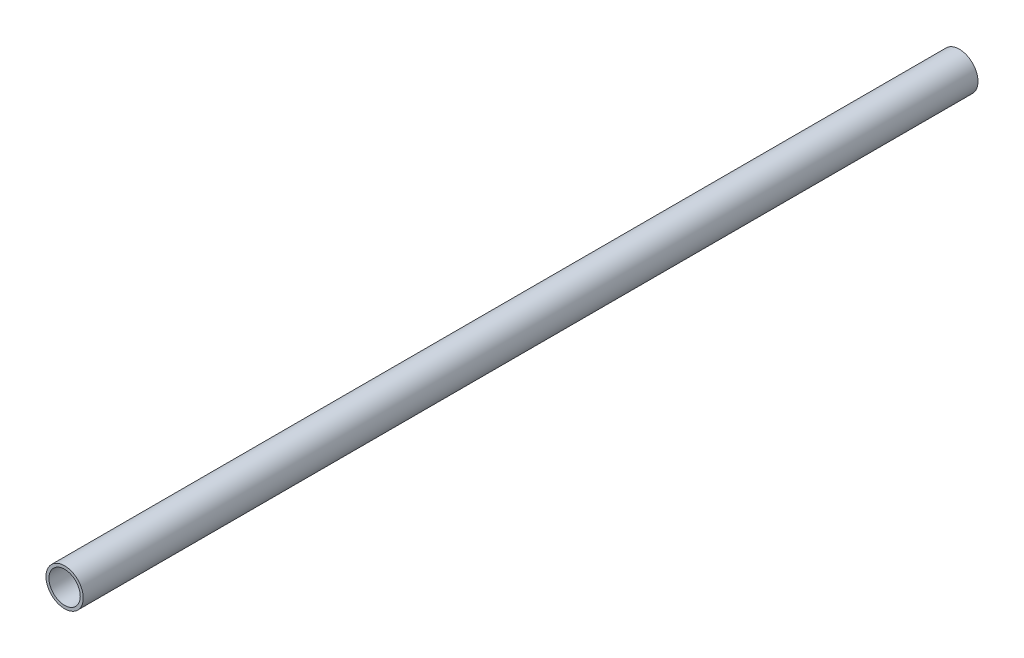
ISO-10303-21;
HEADER;
FILE_DESCRIPTION(('STEP AP214'),'2;1');
FILE_NAME('part.step','',(''),(''),'','','');
FILE_SCHEMA(('AUTOMOTIVE_DESIGN { 1 0 10303 214 1 1 1 1 }'));
ENDSEC;
DATA;
#1=APPLICATION_CONTEXT('core data for automotive mechanical design processes');
#2=APPLICATION_PROTOCOL_DEFINITION('international standard','automotive_design',2000,#1);
#3=PRODUCT_CONTEXT('',#1,'mechanical');
#4=PRODUCT('Part','Part','',(#3));
#5=PRODUCT_RELATED_PRODUCT_CATEGORY('part','',(#4));
#6=PRODUCT_DEFINITION_FORMATION('','',#4);
#7=PRODUCT_DEFINITION_CONTEXT('part definition',#1,'design');
#8=PRODUCT_DEFINITION('design','',#6,#7);
#9=PRODUCT_DEFINITION_SHAPE('','',#8);
#10=(LENGTH_UNIT() NAMED_UNIT(*) SI_UNIT(.MILLI.,.METRE.));
#11=(NAMED_UNIT(*) PLANE_ANGLE_UNIT() SI_UNIT($,.RADIAN.));
#12=(NAMED_UNIT(*) SI_UNIT($,.STERADIAN.) SOLID_ANGLE_UNIT());
#13=UNCERTAINTY_MEASURE_WITH_UNIT(LENGTH_MEASURE(1.E-05),#10,'distance_accuracy_value','');
#14=(GEOMETRIC_REPRESENTATION_CONTEXT(3) GLOBAL_UNCERTAINTY_ASSIGNED_CONTEXT((#13)) GLOBAL_UNIT_ASSIGNED_CONTEXT((#10,
#11,#12)) REPRESENTATION_CONTEXT('',''));
#15=CARTESIAN_POINT('',(0.,0.,0.));
#16=DIRECTION('',(0.,0.,1.));
#17=DIRECTION('',(1.,0.,0.));
#18=AXIS2_PLACEMENT_3D('',#15,#16,#17);
#19=CARTESIAN_POINT('',(0.,0.,457.2));
#20=DIRECTION('',(0.,0.,1.));
#21=DIRECTION('',(1.,0.,0.));
#22=AXIS2_PLACEMENT_3D('',#19,#20,#21);
#23=PLANE('',#22);
#24=CARTESIAN_POINT('',(0.,0.,457.2));
#25=DIRECTION('',(0.,0.,1.));
#26=DIRECTION('',(1.,0.,0.));
#27=AXIS2_PLACEMENT_3D('',#24,#25,#26);
#28=CIRCLE('',#27,19.05);
#29=CARTESIAN_POINT('',(19.05,0.,457.2));
#30=VERTEX_POINT('',#29);
#31=EDGE_CURVE('E10',#30,#30,#28,.T.);
#32=ORIENTED_EDGE('',*,*,#31,.T.);
#33=EDGE_LOOP('',(#32));
#34=FACE_BOUND('',#33,.T.);
#35=CARTESIAN_POINT('',(0.,0.,457.2));
#36=DIRECTION('',(0.,0.,1.));
#37=DIRECTION('',(1.,0.,0.));
#38=AXIS2_PLACEMENT_3D('',#35,#36,#37);
#39=CIRCLE('',#38,16.002);
#40=CARTESIAN_POINT('',(16.002,0.,457.2));
#41=VERTEX_POINT('',#40);
#42=EDGE_CURVE('E39',#41,#41,#39,.T.);
#43=ORIENTED_EDGE('',*,*,#42,.F.);
#44=EDGE_LOOP('',(#43));
#45=FACE_BOUND('',#44,.T.);
#46=ADVANCED_FACE('F32',(#34,#45),#23,.T.);
#47=CARTESIAN_POINT('',(0.,0.,457.2));
#48=DIRECTION('',(0.,0.,-1.));
#49=DIRECTION('',(-1.,0.,0.));
#50=AXIS2_PLACEMENT_3D('',#47,#48,#49);
#51=CYLINDRICAL_SURFACE('',#50,19.05);
#52=ORIENTED_EDGE('',*,*,#31,.F.);
#53=EDGE_LOOP('',(#52));
#54=FACE_BOUND('',#53,.T.);
#55=CARTESIAN_POINT('',(0.,0.,-457.2));
#56=DIRECTION('',(0.,0.,1.));
#57=DIRECTION('',(1.,0.,0.));
#58=AXIS2_PLACEMENT_3D('',#55,#56,#57);
#59=CIRCLE('',#58,19.05);
#60=CARTESIAN_POINT('',(19.05,0.,-457.2));
#61=VERTEX_POINT('',#60);
#62=EDGE_CURVE('E43',#61,#61,#59,.T.);
#63=ORIENTED_EDGE('',*,*,#62,.T.);
#64=EDGE_LOOP('',(#63));
#65=FACE_BOUND('',#64,.T.);
#66=ADVANCED_FACE('F34',(#54,#65),#51,.T.);
#67=CARTESIAN_POINT('',(0.,0.,457.2));
#68=DIRECTION('',(0.,0.,-1.));
#69=DIRECTION('',(-1.,0.,0.));
#70=AXIS2_PLACEMENT_3D('',#67,#68,#69);
#71=CYLINDRICAL_SURFACE('',#70,16.002);
#72=ORIENTED_EDGE('',*,*,#42,.T.);
#73=EDGE_LOOP('',(#72));
#74=FACE_BOUND('',#73,.T.);
#75=CARTESIAN_POINT('',(0.,0.,-457.2));
#76=DIRECTION('',(0.,0.,1.));
#77=DIRECTION('',(1.,0.,0.));
#78=AXIS2_PLACEMENT_3D('',#75,#76,#77);
#79=CIRCLE('',#78,16.002);
#80=CARTESIAN_POINT('',(16.002,0.,-457.2));
#81=VERTEX_POINT('',#80);
#82=EDGE_CURVE('E47',#81,#81,#79,.T.);
#83=ORIENTED_EDGE('',*,*,#82,.F.);
#84=EDGE_LOOP('',(#83));
#85=FACE_BOUND('',#84,.T.);
#86=ADVANCED_FACE('F56',(#74,#85),#71,.F.);
#87=CARTESIAN_POINT('',(0.,0.,-457.2));
#88=DIRECTION('',(0.,0.,1.));
#89=DIRECTION('',(1.,0.,0.));
#90=AXIS2_PLACEMENT_3D('',#87,#88,#89);
#91=PLANE('',#90);
#92=ORIENTED_EDGE('',*,*,#82,.T.);
#93=EDGE_LOOP('',(#92));
#94=FACE_BOUND('',#93,.T.);
#95=ORIENTED_EDGE('',*,*,#62,.F.);
#96=EDGE_LOOP('',(#95));
#97=FACE_BOUND('',#96,.T.);
#98=ADVANCED_FACE('F53',(#94,#97),#91,.F.);
#99=CLOSED_SHELL('',(#46,#66,#86,#98));
#100=MANIFOLD_SOLID_BREP('B2',#99);
#101=ADVANCED_BREP_SHAPE_REPRESENTATION('',(#18,#100),#14);
#102=SHAPE_DEFINITION_REPRESENTATION(#9,#101);
ENDSEC;
END-ISO-10303-21;
